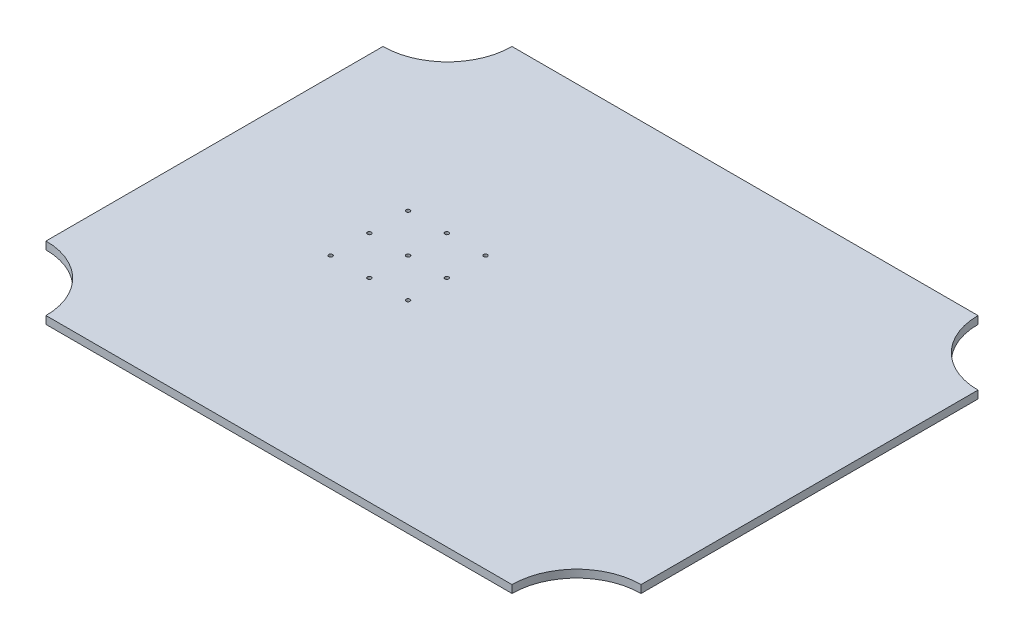
ISO-10303-21;
HEADER;
FILE_DESCRIPTION(('STEP AP214'),'2;1');
FILE_NAME('part.step','',(''),(''),'','','');
FILE_SCHEMA(('AUTOMOTIVE_DESIGN { 1 0 10303 214 1 1 1 1 }'));
ENDSEC;
DATA;
#1=APPLICATION_CONTEXT('core data for automotive mechanical design processes');
#2=APPLICATION_PROTOCOL_DEFINITION('international standard','automotive_design',2000,#1);
#3=PRODUCT_CONTEXT('',#1,'mechanical');
#4=PRODUCT('Part','Part','',(#3));
#5=PRODUCT_RELATED_PRODUCT_CATEGORY('part','',(#4));
#6=PRODUCT_DEFINITION_FORMATION('','',#4);
#7=PRODUCT_DEFINITION_CONTEXT('part definition',#1,'design');
#8=PRODUCT_DEFINITION('design','',#6,#7);
#9=PRODUCT_DEFINITION_SHAPE('','',#8);
#10=(LENGTH_UNIT() NAMED_UNIT(*) SI_UNIT(.MILLI.,.METRE.));
#11=(NAMED_UNIT(*) PLANE_ANGLE_UNIT() SI_UNIT($,.RADIAN.));
#12=(NAMED_UNIT(*) SI_UNIT($,.STERADIAN.) SOLID_ANGLE_UNIT());
#13=UNCERTAINTY_MEASURE_WITH_UNIT(LENGTH_MEASURE(1.E-05),#10,'distance_accuracy_value','');
#14=(GEOMETRIC_REPRESENTATION_CONTEXT(3) GLOBAL_UNCERTAINTY_ASSIGNED_CONTEXT((#13)) GLOBAL_UNIT_ASSIGNED_CONTEXT((#10,
#11,#12)) REPRESENTATION_CONTEXT('',''));
#15=CARTESIAN_POINT('',(0.,0.,0.));
#16=DIRECTION('',(0.,0.,1.));
#17=DIRECTION('',(1.,0.,0.));
#18=AXIS2_PLACEMENT_3D('',#15,#16,#17);
#19=CARTESIAN_POINT('',(-150.,6.,-180.5));
#20=DIRECTION('',(0.,1.,0.));
#21=DIRECTION('',(0.,0.,1.));
#22=AXIS2_PLACEMENT_3D('',#19,#20,#21);
#23=PLANE('',#22);
#24=CARTESIAN_POINT('',(0.,6.,30.));
#25=DIRECTION('',(0.,1.,0.));
#26=DIRECTION('',(0.,0.,-1.));
#27=AXIS2_PLACEMENT_3D('',#24,#25,#26);
#28=CIRCLE('',#27,1.5);
#29=CARTESIAN_POINT('',(0.,6.,28.5));
#30=VERTEX_POINT('',#29);
#31=EDGE_CURVE('E203',#30,#30,#28,.T.);
#32=ORIENTED_EDGE('',*,*,#31,.F.);
#33=EDGE_LOOP('',(#32));
#34=FACE_BOUND('',#33,.T.);
#35=CARTESIAN_POINT('',(30.,6.,0.));
#36=DIRECTION('',(0.,1.,0.));
#37=DIRECTION('',(0.,0.,1.));
#38=AXIS2_PLACEMENT_3D('',#35,#36,#37);
#39=CIRCLE('',#38,1.5);
#40=CARTESIAN_POINT('',(30.,6.,1.5));
#41=VERTEX_POINT('',#40);
#42=EDGE_CURVE('E197',#41,#41,#39,.T.);
#43=ORIENTED_EDGE('',*,*,#42,.F.);
#44=EDGE_LOOP('',(#43));
#45=FACE_BOUND('',#44,.T.);
#46=CARTESIAN_POINT('',(30.,6.,-30.));
#47=DIRECTION('',(0.,1.,0.));
#48=DIRECTION('',(0.,0.,1.));
#49=AXIS2_PLACEMENT_3D('',#46,#47,#48);
#50=CIRCLE('',#49,1.5);
#51=CARTESIAN_POINT('',(30.,6.,-28.5));
#52=VERTEX_POINT('',#51);
#53=EDGE_CURVE('E191',#52,#52,#50,.T.);
#54=ORIENTED_EDGE('',*,*,#53,.F.);
#55=EDGE_LOOP('',(#54));
#56=FACE_BOUND('',#55,.T.);
#57=CARTESIAN_POINT('',(-30.,6.,-30.));
#58=DIRECTION('',(0.,1.,0.));
#59=DIRECTION('',(0.,0.,1.));
#60=AXIS2_PLACEMENT_3D('',#57,#58,#59);
#61=CIRCLE('',#60,1.5);
#62=CARTESIAN_POINT('',(-30.,6.,-28.5));
#63=VERTEX_POINT('',#62);
#64=EDGE_CURVE('E165',#63,#63,#61,.T.);
#65=ORIENTED_EDGE('',*,*,#64,.F.);
#66=EDGE_LOOP('',(#65));
#67=FACE_BOUND('',#66,.T.);
#68=CARTESIAN_POINT('',(-150.,6.,-180.5));
#69=DIRECTION('',(0.,-1.,0.));
#70=DIRECTION('',(0.,0.,1.));
#71=AXIS2_PLACEMENT_3D('',#68,#69,#70);
#72=CIRCLE('',#71,50.);
#73=CARTESIAN_POINT('',(-99.9999999999999,6.,-180.5));
#74=VERTEX_POINT('',#73);
#75=CARTESIAN_POINT('',(-150.,6.,-130.5));
#76=VERTEX_POINT('',#75);
#77=EDGE_CURVE('E166',#74,#76,#72,.T.);
#78=ORIENTED_EDGE('',*,*,#77,.T.);
#79=DIRECTION('',(0.,0.,1.));
#80=VECTOR('',#79,1.);
#81=CARTESIAN_POINT('',(-150.,6.,-130.5));
#82=LINE('',#81,#80);
#83=CARTESIAN_POINT('',(-150.,6.,130.5));
#84=VERTEX_POINT('',#83);
#85=EDGE_CURVE('E101',#76,#84,#82,.T.);
#86=ORIENTED_EDGE('',*,*,#85,.T.);
#87=CARTESIAN_POINT('',(-150.,6.,180.5));
#88=DIRECTION('',(0.,-1.,0.));
#89=DIRECTION('',(0.,0.,1.));
#90=AXIS2_PLACEMENT_3D('',#87,#88,#89);
#91=CIRCLE('',#90,50.);
#92=CARTESIAN_POINT('',(-99.9999999999999,6.,180.5));
#93=VERTEX_POINT('',#92);
#94=EDGE_CURVE('E179',#84,#93,#91,.T.);
#95=ORIENTED_EDGE('',*,*,#94,.T.);
#96=DIRECTION('',(1.,0.,0.));
#97=VECTOR('',#96,1.);
#98=CARTESIAN_POINT('',(-99.9999999999999,6.,180.5));
#99=LINE('',#98,#97);
#100=CARTESIAN_POINT('',(261.,6.,180.5));
#101=VERTEX_POINT('',#100);
#102=EDGE_CURVE('E182',#93,#101,#99,.T.);
#103=ORIENTED_EDGE('',*,*,#102,.T.);
#104=CARTESIAN_POINT('',(311.,6.,180.5));
#105=DIRECTION('',(0.,-1.,0.));
#106=DIRECTION('',(0.,0.,1.));
#107=AXIS2_PLACEMENT_3D('',#104,#105,#106);
#108=CIRCLE('',#107,50.);
#109=CARTESIAN_POINT('',(311.,6.,130.5));
#110=VERTEX_POINT('',#109);
#111=EDGE_CURVE('E120',#101,#110,#108,.T.);
#112=ORIENTED_EDGE('',*,*,#111,.T.);
#113=DIRECTION('',(0.,0.,-1.));
#114=VECTOR('',#113,1.);
#115=CARTESIAN_POINT('',(311.,6.,-130.5));
#116=LINE('',#115,#114);
#117=CARTESIAN_POINT('',(311.,6.,-130.5));
#118=VERTEX_POINT('',#117);
#119=EDGE_CURVE('E114',#110,#118,#116,.T.);
#120=ORIENTED_EDGE('',*,*,#119,.T.);
#121=CARTESIAN_POINT('',(311.,6.,-180.5));
#122=DIRECTION('',(0.,-1.,0.));
#123=DIRECTION('',(0.,0.,1.));
#124=AXIS2_PLACEMENT_3D('',#121,#122,#123);
#125=CIRCLE('',#124,50.);
#126=CARTESIAN_POINT('',(261.,6.,-180.5));
#127=VERTEX_POINT('',#126);
#128=EDGE_CURVE('E118',#118,#127,#125,.T.);
#129=ORIENTED_EDGE('',*,*,#128,.T.);
#130=DIRECTION('',(-1.,0.,0.));
#131=VECTOR('',#130,1.);
#132=CARTESIAN_POINT('',(-99.9999999999999,6.,-180.5));
#133=LINE('',#132,#131);
#134=EDGE_CURVE('E58',#127,#74,#133,.T.);
#135=ORIENTED_EDGE('',*,*,#134,.T.);
#136=EDGE_LOOP('',(#78,#86,#95,#103,#112,#120,#129,#135));
#137=FACE_BOUND('',#136,.T.);
#138=CARTESIAN_POINT('',(-30.,6.,0.));
#139=DIRECTION('',(0.,1.,0.));
#140=DIRECTION('',(0.,0.,1.));
#141=AXIS2_PLACEMENT_3D('',#138,#139,#140);
#142=CIRCLE('',#141,1.5);
#143=CARTESIAN_POINT('',(-30.,6.,1.5));
#144=VERTEX_POINT('',#143);
#145=EDGE_CURVE('E153',#144,#144,#142,.T.);
#146=ORIENTED_EDGE('',*,*,#145,.F.);
#147=EDGE_LOOP('',(#146));
#148=FACE_BOUND('',#147,.T.);
#149=CARTESIAN_POINT('',(0.,6.,-30.));
#150=DIRECTION('',(0.,1.,0.));
#151=DIRECTION('',(0.,0.,1.));
#152=AXIS2_PLACEMENT_3D('',#149,#150,#151);
#153=CIRCLE('',#152,1.5);
#154=CARTESIAN_POINT('',(0.,6.,-28.5));
#155=VERTEX_POINT('',#154);
#156=EDGE_CURVE('E373',#155,#155,#153,.T.);
#157=ORIENTED_EDGE('',*,*,#156,.F.);
#158=EDGE_LOOP('',(#157));
#159=FACE_BOUND('',#158,.T.);
#160=CARTESIAN_POINT('',(0.,6.,0.));
#161=DIRECTION('',(0.,1.,0.));
#162=DIRECTION('',(0.,0.,1.));
#163=AXIS2_PLACEMENT_3D('',#160,#161,#162);
#164=CIRCLE('',#163,1.5);
#165=CARTESIAN_POINT('',(0.,6.,1.5));
#166=VERTEX_POINT('',#165);
#167=EDGE_CURVE('E226',#166,#166,#164,.T.);
#168=ORIENTED_EDGE('',*,*,#167,.F.);
#169=EDGE_LOOP('',(#168));
#170=FACE_BOUND('',#169,.T.);
#171=CARTESIAN_POINT('',(30.,6.,30.));
#172=DIRECTION('',(0.,1.,0.));
#173=DIRECTION('',(0.,0.,-1.));
#174=AXIS2_PLACEMENT_3D('',#171,#172,#173);
#175=CIRCLE('',#174,1.5);
#176=CARTESIAN_POINT('',(30.,6.,28.5));
#177=VERTEX_POINT('',#176);
#178=EDGE_CURVE('E211',#177,#177,#175,.T.);
#179=ORIENTED_EDGE('',*,*,#178,.F.);
#180=EDGE_LOOP('',(#179));
#181=FACE_BOUND('',#180,.T.);
#182=CARTESIAN_POINT('',(-30.,6.,30.));
#183=DIRECTION('',(0.,1.,0.));
#184=DIRECTION('',(0.,0.,-1.));
#185=AXIS2_PLACEMENT_3D('',#182,#183,#184);
#186=CIRCLE('',#185,1.5);
#187=CARTESIAN_POINT('',(-30.,6.,28.5));
#188=VERTEX_POINT('',#187);
#189=EDGE_CURVE('E214',#188,#188,#186,.T.);
#190=ORIENTED_EDGE('',*,*,#189,.F.);
#191=EDGE_LOOP('',(#190));
#192=FACE_BOUND('',#191,.T.);
#193=ADVANCED_FACE('F41',(#34,#45,#56,#67,#137,#148,#159,#170,#181,#192),#23,.T.);
#194=CARTESIAN_POINT('',(-150.,0.,-180.5));
#195=DIRECTION('',(0.,1.,0.));
#196=DIRECTION('',(0.,0.,1.));
#197=AXIS2_PLACEMENT_3D('',#194,#195,#196);
#198=PLANE('',#197);
#199=CARTESIAN_POINT('',(-150.,0.,-180.5));
#200=DIRECTION('',(0.,-1.,0.));
#201=DIRECTION('',(0.,0.,1.));
#202=AXIS2_PLACEMENT_3D('',#199,#200,#201);
#203=CIRCLE('',#202,50.);
#204=CARTESIAN_POINT('',(-99.9999999999999,0.,-180.5));
#205=VERTEX_POINT('',#204);
#206=CARTESIAN_POINT('',(-150.,0.,-130.5));
#207=VERTEX_POINT('',#206);
#208=EDGE_CURVE('E159',#205,#207,#203,.T.);
#209=ORIENTED_EDGE('',*,*,#208,.F.);
#210=DIRECTION('',(-1.,0.,0.));
#211=VECTOR('',#210,1.);
#212=CARTESIAN_POINT('',(-99.9999999999999,0.,-180.5));
#213=LINE('',#212,#211);
#214=CARTESIAN_POINT('',(261.,0.,-180.5));
#215=VERTEX_POINT('',#214);
#216=EDGE_CURVE('E93',#215,#205,#213,.T.);
#217=ORIENTED_EDGE('',*,*,#216,.F.);
#218=CARTESIAN_POINT('',(311.,0.,-180.5));
#219=DIRECTION('',(0.,-1.,0.));
#220=DIRECTION('',(0.,0.,1.));
#221=AXIS2_PLACEMENT_3D('',#218,#219,#220);
#222=CIRCLE('',#221,50.);
#223=CARTESIAN_POINT('',(311.,0.,-130.5));
#224=VERTEX_POINT('',#223);
#225=EDGE_CURVE('E87',#224,#215,#222,.T.);
#226=ORIENTED_EDGE('',*,*,#225,.F.);
#227=DIRECTION('',(0.,0.,-1.));
#228=VECTOR('',#227,1.);
#229=CARTESIAN_POINT('',(311.,0.,-130.5));
#230=LINE('',#229,#228);
#231=CARTESIAN_POINT('',(311.,0.,130.5));
#232=VERTEX_POINT('',#231);
#233=EDGE_CURVE('E129',#232,#224,#230,.T.);
#234=ORIENTED_EDGE('',*,*,#233,.F.);
#235=CARTESIAN_POINT('',(311.,0.,180.5));
#236=DIRECTION('',(0.,-1.,0.));
#237=DIRECTION('',(0.,0.,1.));
#238=AXIS2_PLACEMENT_3D('',#235,#236,#237);
#239=CIRCLE('',#238,50.);
#240=CARTESIAN_POINT('',(261.,0.,180.5));
#241=VERTEX_POINT('',#240);
#242=EDGE_CURVE('E332',#241,#232,#239,.T.);
#243=ORIENTED_EDGE('',*,*,#242,.F.);
#244=DIRECTION('',(1.,0.,0.));
#245=VECTOR('',#244,1.);
#246=CARTESIAN_POINT('',(-99.9999999999999,0.,180.5));
#247=LINE('',#246,#245);
#248=CARTESIAN_POINT('',(-99.9999999999999,0.,180.5));
#249=VERTEX_POINT('',#248);
#250=EDGE_CURVE('E330',#249,#241,#247,.T.);
#251=ORIENTED_EDGE('',*,*,#250,.F.);
#252=CARTESIAN_POINT('',(-150.,0.,180.5));
#253=DIRECTION('',(0.,-1.,0.));
#254=DIRECTION('',(0.,0.,1.));
#255=AXIS2_PLACEMENT_3D('',#252,#253,#254);
#256=CIRCLE('',#255,50.);
#257=CARTESIAN_POINT('',(-150.,0.,130.5));
#258=VERTEX_POINT('',#257);
#259=EDGE_CURVE('E322',#258,#249,#256,.T.);
#260=ORIENTED_EDGE('',*,*,#259,.F.);
#261=DIRECTION('',(0.,0.,1.));
#262=VECTOR('',#261,1.);
#263=CARTESIAN_POINT('',(-150.,0.,-130.5));
#264=LINE('',#263,#262);
#265=EDGE_CURVE('E315',#207,#258,#264,.T.);
#266=ORIENTED_EDGE('',*,*,#265,.F.);
#267=EDGE_LOOP('',(#209,#217,#226,#234,#243,#251,#260,#266));
#268=FACE_BOUND('',#267,.T.);
#269=CARTESIAN_POINT('',(-30.,0.,0.));
#270=DIRECTION('',(0.,1.,0.));
#271=DIRECTION('',(0.,0.,1.));
#272=AXIS2_PLACEMENT_3D('',#269,#270,#271);
#273=CIRCLE('',#272,1.5);
#274=CARTESIAN_POINT('',(-30.,0.,1.5));
#275=VERTEX_POINT('',#274);
#276=EDGE_CURVE('E160',#275,#275,#273,.T.);
#277=ORIENTED_EDGE('',*,*,#276,.T.);
#278=EDGE_LOOP('',(#277));
#279=FACE_BOUND('',#278,.T.);
#280=CARTESIAN_POINT('',(-30.,0.,-30.));
#281=DIRECTION('',(0.,1.,0.));
#282=DIRECTION('',(0.,0.,1.));
#283=AXIS2_PLACEMENT_3D('',#280,#281,#282);
#284=CIRCLE('',#283,1.5);
#285=CARTESIAN_POINT('',(-30.,0.,-28.5));
#286=VERTEX_POINT('',#285);
#287=EDGE_CURVE('E161',#286,#286,#284,.T.);
#288=ORIENTED_EDGE('',*,*,#287,.T.);
#289=EDGE_LOOP('',(#288));
#290=FACE_BOUND('',#289,.T.);
#291=CARTESIAN_POINT('',(0.,0.,-30.));
#292=DIRECTION('',(0.,1.,0.));
#293=DIRECTION('',(0.,0.,1.));
#294=AXIS2_PLACEMENT_3D('',#291,#292,#293);
#295=CIRCLE('',#294,1.5);
#296=CARTESIAN_POINT('',(0.,0.,-28.5));
#297=VERTEX_POINT('',#296);
#298=EDGE_CURVE('E194',#297,#297,#295,.T.);
#299=ORIENTED_EDGE('',*,*,#298,.T.);
#300=EDGE_LOOP('',(#299));
#301=FACE_BOUND('',#300,.T.);
#302=CARTESIAN_POINT('',(30.,0.,-30.));
#303=DIRECTION('',(0.,1.,0.));
#304=DIRECTION('',(0.,0.,1.));
#305=AXIS2_PLACEMENT_3D('',#302,#303,#304);
#306=CIRCLE('',#305,1.5);
#307=CARTESIAN_POINT('',(30.,0.,-28.5));
#308=VERTEX_POINT('',#307);
#309=EDGE_CURVE('E195',#308,#308,#306,.T.);
#310=ORIENTED_EDGE('',*,*,#309,.T.);
#311=EDGE_LOOP('',(#310));
#312=FACE_BOUND('',#311,.T.);
#313=CARTESIAN_POINT('',(0.,0.,0.));
#314=DIRECTION('',(0.,1.,0.));
#315=DIRECTION('',(0.,0.,1.));
#316=AXIS2_PLACEMENT_3D('',#313,#314,#315);
#317=CIRCLE('',#316,1.5);
#318=CARTESIAN_POINT('',(0.,0.,1.5));
#319=VERTEX_POINT('',#318);
#320=EDGE_CURVE('E200',#319,#319,#317,.T.);
#321=ORIENTED_EDGE('',*,*,#320,.T.);
#322=EDGE_LOOP('',(#321));
#323=FACE_BOUND('',#322,.T.);
#324=CARTESIAN_POINT('',(30.,0.,0.));
#325=DIRECTION('',(0.,1.,0.));
#326=DIRECTION('',(0.,0.,1.));
#327=AXIS2_PLACEMENT_3D('',#324,#325,#326);
#328=CIRCLE('',#327,1.5);
#329=CARTESIAN_POINT('',(30.,0.,1.5));
#330=VERTEX_POINT('',#329);
#331=EDGE_CURVE('E201',#330,#330,#328,.T.);
#332=ORIENTED_EDGE('',*,*,#331,.T.);
#333=EDGE_LOOP('',(#332));
#334=FACE_BOUND('',#333,.T.);
#335=CARTESIAN_POINT('',(30.,0.,30.));
#336=DIRECTION('',(0.,1.,0.));
#337=DIRECTION('',(0.,0.,-1.));
#338=AXIS2_PLACEMENT_3D('',#335,#336,#337);
#339=CIRCLE('',#338,1.5);
#340=CARTESIAN_POINT('',(30.,0.,28.5));
#341=VERTEX_POINT('',#340);
#342=EDGE_CURVE('E205',#341,#341,#339,.T.);
#343=ORIENTED_EDGE('',*,*,#342,.T.);
#344=EDGE_LOOP('',(#343));
#345=FACE_BOUND('',#344,.T.);
#346=CARTESIAN_POINT('',(0.,0.,30.));
#347=DIRECTION('',(0.,1.,0.));
#348=DIRECTION('',(0.,0.,-1.));
#349=AXIS2_PLACEMENT_3D('',#346,#347,#348);
#350=CIRCLE('',#349,1.5);
#351=CARTESIAN_POINT('',(0.,0.,28.5));
#352=VERTEX_POINT('',#351);
#353=EDGE_CURVE('E206',#352,#352,#350,.T.);
#354=ORIENTED_EDGE('',*,*,#353,.T.);
#355=EDGE_LOOP('',(#354));
#356=FACE_BOUND('',#355,.T.);
#357=CARTESIAN_POINT('',(-30.,0.,30.));
#358=DIRECTION('',(0.,1.,0.));
#359=DIRECTION('',(0.,0.,-1.));
#360=AXIS2_PLACEMENT_3D('',#357,#358,#359);
#361=CIRCLE('',#360,1.5);
#362=CARTESIAN_POINT('',(-30.,0.,28.5));
#363=VERTEX_POINT('',#362);
#364=EDGE_CURVE('E218',#363,#363,#361,.T.);
#365=ORIENTED_EDGE('',*,*,#364,.T.);
#366=EDGE_LOOP('',(#365));
#367=FACE_BOUND('',#366,.T.);
#368=ADVANCED_FACE('F242',(#268,#279,#290,#301,#312,#323,#334,#345,#356,#367),#198,.F.);
#369=CARTESIAN_POINT('',(-150.,6.,-180.5));
#370=DIRECTION('',(0.,-1.,0.));
#371=DIRECTION('',(0.,0.,-1.));
#372=AXIS2_PLACEMENT_3D('',#369,#370,#371);
#373=CYLINDRICAL_SURFACE('',#372,50.);
#374=ORIENTED_EDGE('',*,*,#208,.T.);
#375=DIRECTION('',(0.,-1.,0.));
#376=VECTOR('',#375,1.);
#377=CARTESIAN_POINT('',(-150.,6.,-130.5));
#378=LINE('',#377,#376);
#379=EDGE_CURVE('E12',#76,#207,#378,.T.);
#380=ORIENTED_EDGE('',*,*,#379,.F.);
#381=ORIENTED_EDGE('',*,*,#77,.F.);
#382=DIRECTION('',(0.,-1.,0.));
#383=VECTOR('',#382,1.);
#384=CARTESIAN_POINT('',(-99.9999999999999,6.,-180.5));
#385=LINE('',#384,#383);
#386=EDGE_CURVE('E137',#74,#205,#385,.T.);
#387=ORIENTED_EDGE('',*,*,#386,.T.);
#388=EDGE_LOOP('',(#374,#380,#381,#387));
#389=FACE_BOUND('',#388,.T.);
#390=ADVANCED_FACE('F43',(#389),#373,.F.);
#391=CARTESIAN_POINT('',(-150.,6.,-130.5));
#392=DIRECTION('',(1.,0.,0.));
#393=DIRECTION('',(0.,0.,-1.));
#394=AXIS2_PLACEMENT_3D('',#391,#392,#393);
#395=PLANE('',#394);
#396=ORIENTED_EDGE('',*,*,#265,.T.);
#397=DIRECTION('',(0.,-1.,0.));
#398=VECTOR('',#397,1.);
#399=CARTESIAN_POINT('',(-150.,6.,130.5));
#400=LINE('',#399,#398);
#401=EDGE_CURVE('E50',#84,#258,#400,.T.);
#402=ORIENTED_EDGE('',*,*,#401,.F.);
#403=ORIENTED_EDGE('',*,*,#85,.F.);
#404=ORIENTED_EDGE('',*,*,#379,.T.);
#405=EDGE_LOOP('',(#396,#402,#403,#404));
#406=FACE_BOUND('',#405,.T.);
#407=ADVANCED_FACE('F308',(#406),#395,.F.);
#408=CARTESIAN_POINT('',(-150.,6.,180.5));
#409=DIRECTION('',(0.,-1.,0.));
#410=DIRECTION('',(0.,0.,-1.));
#411=AXIS2_PLACEMENT_3D('',#408,#409,#410);
#412=CYLINDRICAL_SURFACE('',#411,50.);
#413=ORIENTED_EDGE('',*,*,#259,.T.);
#414=DIRECTION('',(0.,-1.,0.));
#415=VECTOR('',#414,1.);
#416=CARTESIAN_POINT('',(-99.9999999999999,6.,180.5));
#417=LINE('',#416,#415);
#418=EDGE_CURVE('E326',#93,#249,#417,.T.);
#419=ORIENTED_EDGE('',*,*,#418,.F.);
#420=ORIENTED_EDGE('',*,*,#94,.F.);
#421=ORIENTED_EDGE('',*,*,#401,.T.);
#422=EDGE_LOOP('',(#413,#419,#420,#421));
#423=FACE_BOUND('',#422,.T.);
#424=ADVANCED_FACE('F305',(#423),#412,.F.);
#425=CARTESIAN_POINT('',(-99.9999999999999,6.,180.5));
#426=DIRECTION('',(0.,0.,-1.));
#427=DIRECTION('',(-1.,0.,0.));
#428=AXIS2_PLACEMENT_3D('',#425,#426,#427);
#429=PLANE('',#428);
#430=ORIENTED_EDGE('',*,*,#250,.T.);
#431=DIRECTION('',(0.,-1.,0.));
#432=VECTOR('',#431,1.);
#433=CARTESIAN_POINT('',(261.,6.,180.5));
#434=LINE('',#433,#432);
#435=EDGE_CURVE('E342',#101,#241,#434,.T.);
#436=ORIENTED_EDGE('',*,*,#435,.F.);
#437=ORIENTED_EDGE('',*,*,#102,.F.);
#438=ORIENTED_EDGE('',*,*,#418,.T.);
#439=EDGE_LOOP('',(#430,#436,#437,#438));
#440=FACE_BOUND('',#439,.T.);
#441=ADVANCED_FACE('F301',(#440),#429,.F.);
#442=CARTESIAN_POINT('',(311.,6.,180.5));
#443=DIRECTION('',(0.,-1.,0.));
#444=DIRECTION('',(0.,0.,-1.));
#445=AXIS2_PLACEMENT_3D('',#442,#443,#444);
#446=CYLINDRICAL_SURFACE('',#445,50.);
#447=ORIENTED_EDGE('',*,*,#242,.T.);
#448=DIRECTION('',(0.,-1.,0.));
#449=VECTOR('',#448,1.);
#450=CARTESIAN_POINT('',(311.,6.,130.5));
#451=LINE('',#450,#449);
#452=EDGE_CURVE('E130',#110,#232,#451,.T.);
#453=ORIENTED_EDGE('',*,*,#452,.F.);
#454=ORIENTED_EDGE('',*,*,#111,.F.);
#455=ORIENTED_EDGE('',*,*,#435,.T.);
#456=EDGE_LOOP('',(#447,#453,#454,#455));
#457=FACE_BOUND('',#456,.T.);
#458=ADVANCED_FACE('F298',(#457),#446,.F.);
#459=CARTESIAN_POINT('',(311.,6.,-130.5));
#460=DIRECTION('',(-1.,0.,0.));
#461=DIRECTION('',(0.,0.,1.));
#462=AXIS2_PLACEMENT_3D('',#459,#460,#461);
#463=PLANE('',#462);
#464=ORIENTED_EDGE('',*,*,#233,.T.);
#465=DIRECTION('',(0.,-1.,0.));
#466=VECTOR('',#465,1.);
#467=CARTESIAN_POINT('',(311.,6.,-130.5));
#468=LINE('',#467,#466);
#469=EDGE_CURVE('E126',#118,#224,#468,.T.);
#470=ORIENTED_EDGE('',*,*,#469,.F.);
#471=ORIENTED_EDGE('',*,*,#119,.F.);
#472=ORIENTED_EDGE('',*,*,#452,.T.);
#473=EDGE_LOOP('',(#464,#470,#471,#472));
#474=FACE_BOUND('',#473,.T.);
#475=ADVANCED_FACE('F127',(#474),#463,.F.);
#476=CARTESIAN_POINT('',(311.,6.,-180.5));
#477=DIRECTION('',(0.,-1.,0.));
#478=DIRECTION('',(0.,0.,-1.));
#479=AXIS2_PLACEMENT_3D('',#476,#477,#478);
#480=CYLINDRICAL_SURFACE('',#479,50.);
#481=ORIENTED_EDGE('',*,*,#225,.T.);
#482=DIRECTION('',(0.,-1.,0.));
#483=VECTOR('',#482,1.);
#484=CARTESIAN_POINT('',(261.,6.,-180.5));
#485=LINE('',#484,#483);
#486=EDGE_CURVE('E131',#127,#215,#485,.T.);
#487=ORIENTED_EDGE('',*,*,#486,.F.);
#488=ORIENTED_EDGE('',*,*,#128,.F.);
#489=ORIENTED_EDGE('',*,*,#469,.T.);
#490=EDGE_LOOP('',(#481,#487,#488,#489));
#491=FACE_BOUND('',#490,.T.);
#492=ADVANCED_FACE('F133',(#491),#480,.F.);
#493=CARTESIAN_POINT('',(-99.9999999999999,6.,-180.5));
#494=DIRECTION('',(0.,0.,1.));
#495=DIRECTION('',(1.,0.,0.));
#496=AXIS2_PLACEMENT_3D('',#493,#494,#495);
#497=PLANE('',#496);
#498=ORIENTED_EDGE('',*,*,#216,.T.);
#499=ORIENTED_EDGE('',*,*,#386,.F.);
#500=ORIENTED_EDGE('',*,*,#134,.F.);
#501=ORIENTED_EDGE('',*,*,#486,.T.);
#502=EDGE_LOOP('',(#498,#499,#500,#501));
#503=FACE_BOUND('',#502,.T.);
#504=ADVANCED_FACE('F286',(#503),#497,.F.);
#505=CARTESIAN_POINT('',(-30.,6.,0.));
#506=DIRECTION('',(0.,-1.,0.));
#507=DIRECTION('',(0.,0.,-1.));
#508=AXIS2_PLACEMENT_3D('',#505,#506,#507);
#509=CYLINDRICAL_SURFACE('',#508,1.5);
#510=ORIENTED_EDGE('',*,*,#145,.T.);
#511=EDGE_LOOP('',(#510));
#512=FACE_BOUND('',#511,.T.);
#513=ORIENTED_EDGE('',*,*,#276,.F.);
#514=EDGE_LOOP('',(#513));
#515=FACE_BOUND('',#514,.T.);
#516=ADVANCED_FACE('F283',(#512,#515),#509,.F.);
#517=CARTESIAN_POINT('',(-30.,6.,-30.));
#518=DIRECTION('',(0.,-1.,0.));
#519=DIRECTION('',(0.,0.,-1.));
#520=AXIS2_PLACEMENT_3D('',#517,#518,#519);
#521=CYLINDRICAL_SURFACE('',#520,1.5);
#522=ORIENTED_EDGE('',*,*,#64,.T.);
#523=EDGE_LOOP('',(#522));
#524=FACE_BOUND('',#523,.T.);
#525=ORIENTED_EDGE('',*,*,#287,.F.);
#526=EDGE_LOOP('',(#525));
#527=FACE_BOUND('',#526,.T.);
#528=ADVANCED_FACE('F279',(#524,#527),#521,.F.);
#529=CARTESIAN_POINT('',(0.,6.,-30.));
#530=DIRECTION('',(0.,-1.,0.));
#531=DIRECTION('',(0.,0.,-1.));
#532=AXIS2_PLACEMENT_3D('',#529,#530,#531);
#533=CYLINDRICAL_SURFACE('',#532,1.5);
#534=ORIENTED_EDGE('',*,*,#156,.T.);
#535=EDGE_LOOP('',(#534));
#536=FACE_BOUND('',#535,.T.);
#537=ORIENTED_EDGE('',*,*,#298,.F.);
#538=EDGE_LOOP('',(#537));
#539=FACE_BOUND('',#538,.T.);
#540=ADVANCED_FACE('F275',(#536,#539),#533,.F.);
#541=CARTESIAN_POINT('',(30.,6.,-30.));
#542=DIRECTION('',(0.,-1.,0.));
#543=DIRECTION('',(0.,0.,-1.));
#544=AXIS2_PLACEMENT_3D('',#541,#542,#543);
#545=CYLINDRICAL_SURFACE('',#544,1.5);
#546=ORIENTED_EDGE('',*,*,#53,.T.);
#547=EDGE_LOOP('',(#546));
#548=FACE_BOUND('',#547,.T.);
#549=ORIENTED_EDGE('',*,*,#309,.F.);
#550=EDGE_LOOP('',(#549));
#551=FACE_BOUND('',#550,.T.);
#552=ADVANCED_FACE('F271',(#548,#551),#545,.F.);
#553=CARTESIAN_POINT('',(0.,6.,0.));
#554=DIRECTION('',(0.,-1.,0.));
#555=DIRECTION('',(0.,0.,-1.));
#556=AXIS2_PLACEMENT_3D('',#553,#554,#555);
#557=CYLINDRICAL_SURFACE('',#556,1.5);
#558=ORIENTED_EDGE('',*,*,#167,.T.);
#559=EDGE_LOOP('',(#558));
#560=FACE_BOUND('',#559,.T.);
#561=ORIENTED_EDGE('',*,*,#320,.F.);
#562=EDGE_LOOP('',(#561));
#563=FACE_BOUND('',#562,.T.);
#564=ADVANCED_FACE('F267',(#560,#563),#557,.F.);
#565=CARTESIAN_POINT('',(30.,6.,0.));
#566=DIRECTION('',(0.,-1.,0.));
#567=DIRECTION('',(0.,0.,-1.));
#568=AXIS2_PLACEMENT_3D('',#565,#566,#567);
#569=CYLINDRICAL_SURFACE('',#568,1.5);
#570=ORIENTED_EDGE('',*,*,#42,.T.);
#571=EDGE_LOOP('',(#570));
#572=FACE_BOUND('',#571,.T.);
#573=ORIENTED_EDGE('',*,*,#331,.F.);
#574=EDGE_LOOP('',(#573));
#575=FACE_BOUND('',#574,.T.);
#576=ADVANCED_FACE('F264',(#572,#575),#569,.F.);
#577=CARTESIAN_POINT('',(30.,6.,30.));
#578=DIRECTION('',(0.,-1.,0.));
#579=DIRECTION('',(0.,0.,-1.));
#580=AXIS2_PLACEMENT_3D('',#577,#578,#579);
#581=CYLINDRICAL_SURFACE('',#580,1.5);
#582=ORIENTED_EDGE('',*,*,#178,.T.);
#583=EDGE_LOOP('',(#582));
#584=FACE_BOUND('',#583,.T.);
#585=ORIENTED_EDGE('',*,*,#342,.F.);
#586=EDGE_LOOP('',(#585));
#587=FACE_BOUND('',#586,.T.);
#588=ADVANCED_FACE('F237',(#584,#587),#581,.F.);
#589=CARTESIAN_POINT('',(0.,6.,30.));
#590=DIRECTION('',(0.,-1.,0.));
#591=DIRECTION('',(0.,0.,-1.));
#592=AXIS2_PLACEMENT_3D('',#589,#590,#591);
#593=CYLINDRICAL_SURFACE('',#592,1.5);
#594=ORIENTED_EDGE('',*,*,#31,.T.);
#595=EDGE_LOOP('',(#594));
#596=FACE_BOUND('',#595,.T.);
#597=ORIENTED_EDGE('',*,*,#353,.F.);
#598=EDGE_LOOP('',(#597));
#599=FACE_BOUND('',#598,.T.);
#600=ADVANCED_FACE('F255',(#596,#599),#593,.F.);
#601=CARTESIAN_POINT('',(-30.,6.,30.));
#602=DIRECTION('',(0.,-1.,0.));
#603=DIRECTION('',(0.,0.,-1.));
#604=AXIS2_PLACEMENT_3D('',#601,#602,#603);
#605=CYLINDRICAL_SURFACE('',#604,1.5);
#606=ORIENTED_EDGE('',*,*,#189,.T.);
#607=EDGE_LOOP('',(#606));
#608=FACE_BOUND('',#607,.T.);
#609=ORIENTED_EDGE('',*,*,#364,.F.);
#610=EDGE_LOOP('',(#609));
#611=FACE_BOUND('',#610,.T.);
#612=ADVANCED_FACE('F253',(#608,#611),#605,.F.);
#613=CLOSED_SHELL('',(#193,#368,#390,#407,#424,#441,#458,#475,#492,#504,#516,#528,#540,#552,
#564,#576,#588,#600,#612));
#614=MANIFOLD_SOLID_BREP('B2',#613);
#615=ADVANCED_BREP_SHAPE_REPRESENTATION('',(#18,#614),#14);
#616=SHAPE_DEFINITION_REPRESENTATION(#9,#615);
ENDSEC;
END-ISO-10303-21;
